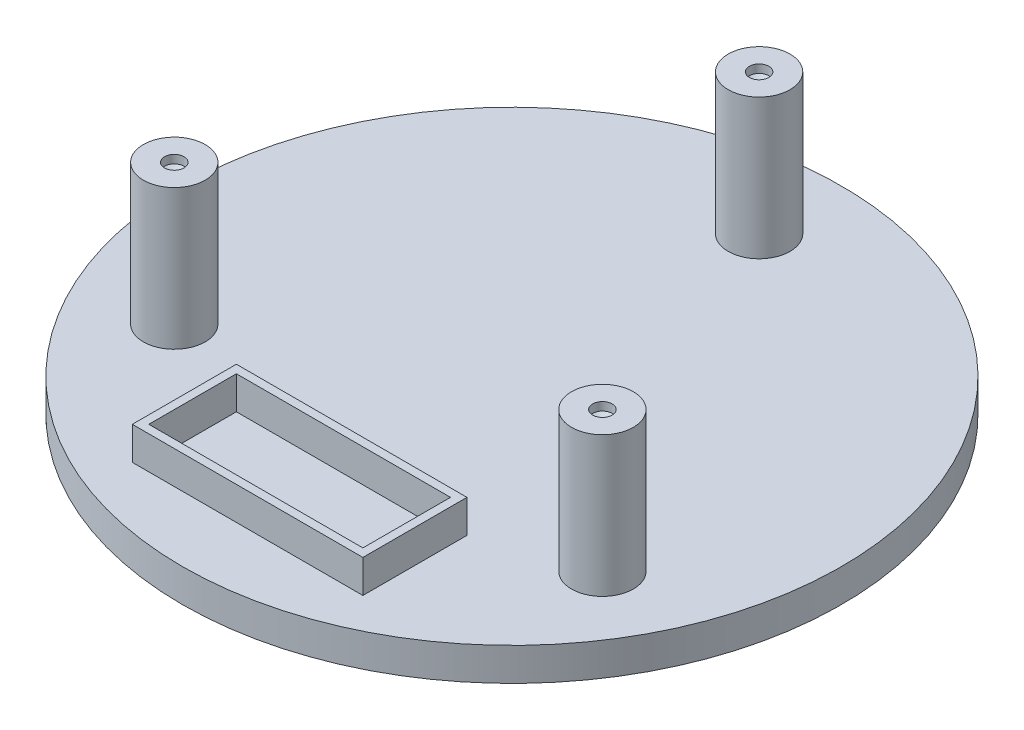
ISO-10303-21;
HEADER;
FILE_DESCRIPTION(('STEP AP214'),'2;1');
FILE_NAME('part.step','',(''),(''),'','','');
FILE_SCHEMA(('AUTOMOTIVE_DESIGN { 1 0 10303 214 1 1 1 1 }'));
ENDSEC;
DATA;
#1=APPLICATION_CONTEXT('core data for automotive mechanical design processes');
#2=APPLICATION_PROTOCOL_DEFINITION('international standard','automotive_design',2000,#1);
#3=PRODUCT_CONTEXT('',#1,'mechanical');
#4=PRODUCT('Part','Part','',(#3));
#5=PRODUCT_RELATED_PRODUCT_CATEGORY('part','',(#4));
#6=PRODUCT_DEFINITION_FORMATION('','',#4);
#7=PRODUCT_DEFINITION_CONTEXT('part definition',#1,'design');
#8=PRODUCT_DEFINITION('design','',#6,#7);
#9=PRODUCT_DEFINITION_SHAPE('','',#8);
#10=(LENGTH_UNIT() NAMED_UNIT(*) SI_UNIT(.MILLI.,.METRE.));
#11=(NAMED_UNIT(*) PLANE_ANGLE_UNIT() SI_UNIT($,.RADIAN.));
#12=(NAMED_UNIT(*) SI_UNIT($,.STERADIAN.) SOLID_ANGLE_UNIT());
#13=UNCERTAINTY_MEASURE_WITH_UNIT(LENGTH_MEASURE(1.E-05),#10,'distance_accuracy_value','');
#14=(GEOMETRIC_REPRESENTATION_CONTEXT(3) GLOBAL_UNCERTAINTY_ASSIGNED_CONTEXT((#13)) GLOBAL_UNIT_ASSIGNED_CONTEXT((#10,
#11,#12)) REPRESENTATION_CONTEXT('',''));
#15=CARTESIAN_POINT('',(0.,0.,0.));
#16=DIRECTION('',(0.,0.,1.));
#17=DIRECTION('',(1.,0.,0.));
#18=AXIS2_PLACEMENT_3D('',#15,#16,#17);
#19=CARTESIAN_POINT('',(0.,0.,0.));
#20=DIRECTION('',(0.,1.,0.));
#21=DIRECTION('',(0.,0.,1.));
#22=AXIS2_PLACEMENT_3D('',#19,#20,#21);
#23=PLANE('',#22);
#24=CARTESIAN_POINT('',(-32.995567884187,0.,19.0500000000002));
#25=DIRECTION('',(0.,1.,0.));
#26=DIRECTION('',(0.,0.,1.));
#27=AXIS2_PLACEMENT_3D('',#24,#25,#26);
#28=CIRCLE('',#27,4.7625);
#29=CARTESIAN_POINT('',(-32.995567884187,0.,23.8125000000002));
#30=VERTEX_POINT('',#29);
#31=EDGE_CURVE('E249',#30,#30,#28,.T.);
#32=ORIENTED_EDGE('',*,*,#31,.F.);
#33=EDGE_LOOP('',(#32));
#34=FACE_BOUND('',#33,.T.);
#35=CARTESIAN_POINT('',(0.,0.,0.));
#36=DIRECTION('',(0.,1.,0.));
#37=DIRECTION('',(0.,0.,1.));
#38=AXIS2_PLACEMENT_3D('',#35,#36,#37);
#39=CIRCLE('',#38,50.8);
#40=CARTESIAN_POINT('',(0.,0.,50.8));
#41=VERTEX_POINT('',#40);
#42=EDGE_CURVE('E11',#41,#41,#39,.T.);
#43=ORIENTED_EDGE('',*,*,#42,.T.);
#44=EDGE_LOOP('',(#43));
#45=FACE_BOUND('',#44,.T.);
#46=CARTESIAN_POINT('',(0.,0.,-38.1));
#47=DIRECTION('',(0.,1.,0.));
#48=DIRECTION('',(0.,0.,1.));
#49=AXIS2_PLACEMENT_3D('',#46,#47,#48);
#50=CIRCLE('',#49,4.7625);
#51=CARTESIAN_POINT('',(0.,0.,-33.3375));
#52=VERTEX_POINT('',#51);
#53=EDGE_CURVE('E257',#52,#52,#50,.T.);
#54=ORIENTED_EDGE('',*,*,#53,.F.);
#55=EDGE_LOOP('',(#54));
#56=FACE_BOUND('',#55,.T.);
#57=CARTESIAN_POINT('',(32.995567884187,0.,19.0500000000002));
#58=DIRECTION('',(0.,1.,0.));
#59=DIRECTION('',(0.,0.,1.));
#60=AXIS2_PLACEMENT_3D('',#57,#58,#59);
#61=CIRCLE('',#60,4.7625);
#62=CARTESIAN_POINT('',(32.995567884187,0.,23.8125000000002));
#63=VERTEX_POINT('',#62);
#64=EDGE_CURVE('E244',#63,#63,#61,.T.);
#65=ORIENTED_EDGE('',*,*,#64,.F.);
#66=EDGE_LOOP('',(#65));
#67=FACE_BOUND('',#66,.T.);
#68=DIRECTION('',(1.,0.,0.));
#69=VECTOR('',#68,1.);
#70=CARTESIAN_POINT('',(-17.77,0.,40.7434608250207));
#71=LINE('',#70,#69);
#72=CARTESIAN_POINT('',(-17.77,0.,40.7434608250207));
#73=VERTEX_POINT('',#72);
#74=CARTESIAN_POINT('',(17.77,0.,40.7434608250207));
#75=VERTEX_POINT('',#74);
#76=EDGE_CURVE('E202',#73,#75,#71,.T.);
#77=ORIENTED_EDGE('',*,*,#76,.F.);
#78=DIRECTION('',(0.,0.,1.));
#79=VECTOR('',#78,1.);
#80=CARTESIAN_POINT('',(-17.77,0.,24.7034608250207));
#81=LINE('',#80,#79);
#82=CARTESIAN_POINT('',(-17.77,0.,24.7034608250207));
#83=VERTEX_POINT('',#82);
#84=EDGE_CURVE('E151',#83,#73,#81,.T.);
#85=ORIENTED_EDGE('',*,*,#84,.F.);
#86=DIRECTION('',(-1.,0.,0.));
#87=VECTOR('',#86,1.);
#88=CARTESIAN_POINT('',(-17.77,0.,24.7034608250207));
#89=LINE('',#88,#87);
#90=CARTESIAN_POINT('',(17.77,0.,24.7034608250207));
#91=VERTEX_POINT('',#90);
#92=EDGE_CURVE('E190',#91,#83,#89,.T.);
#93=ORIENTED_EDGE('',*,*,#92,.F.);
#94=DIRECTION('',(0.,0.,-1.));
#95=VECTOR('',#94,1.);
#96=CARTESIAN_POINT('',(17.77,0.,24.7034608250207));
#97=LINE('',#96,#95);
#98=EDGE_CURVE('E205',#75,#91,#97,.T.);
#99=ORIENTED_EDGE('',*,*,#98,.F.);
#100=EDGE_LOOP('',(#77,#85,#93,#99));
#101=FACE_BOUND('',#100,.T.);
#102=ADVANCED_FACE('F43',(#34,#45,#56,#67,#101),#23,.T.);
#103=CARTESIAN_POINT('',(0.,-2.54000000000001,0.));
#104=DIRECTION('',(0.,-1.,0.));
#105=DIRECTION('',(0.,0.,-1.));
#106=AXIS2_PLACEMENT_3D('',#103,#104,#105);
#107=PLANE('',#106);
#108=CARTESIAN_POINT('',(0.,-2.54000000000001,0.));
#109=DIRECTION('',(0.,1.,0.));
#110=DIRECTION('',(0.,0.,1.));
#111=AXIS2_PLACEMENT_3D('',#108,#109,#110);
#112=CIRCLE('',#111,38.1);
#113=CARTESIAN_POINT('',(0.,-2.54000000000001,38.1));
#114=VERTEX_POINT('',#113);
#115=EDGE_CURVE('E264',#114,#114,#112,.T.);
#116=ORIENTED_EDGE('',*,*,#115,.F.);
#117=EDGE_LOOP('',(#116));
#118=FACE_BOUND('',#117,.T.);
#119=ADVANCED_FACE('F45',(#118),#107,.T.);
#120=CARTESIAN_POINT('',(0.,4.56768535142939,0.));
#121=DIRECTION('',(0.,1.,0.));
#122=DIRECTION('',(0.,0.,1.));
#123=AXIS2_PLACEMENT_3D('',#120,#121,#122);
#124=CYLINDRICAL_SURFACE('',#123,50.8);
#125=CARTESIAN_POINT('',(0.,-5.08000000000001,0.));
#126=DIRECTION('',(0.,1.,0.));
#127=DIRECTION('',(0.,0.,1.));
#128=AXIS2_PLACEMENT_3D('',#125,#126,#127);
#129=CIRCLE('',#128,50.8);
#130=CARTESIAN_POINT('',(0.,-5.08000000000001,50.8));
#131=VERTEX_POINT('',#130);
#132=EDGE_CURVE('E52',#131,#131,#129,.T.);
#133=ORIENTED_EDGE('',*,*,#132,.T.);
#134=EDGE_LOOP('',(#133));
#135=FACE_BOUND('',#134,.T.);
#136=ORIENTED_EDGE('',*,*,#42,.F.);
#137=EDGE_LOOP('',(#136));
#138=FACE_BOUND('',#137,.T.);
#139=ADVANCED_FACE('F278',(#135,#138),#124,.T.);
#140=CARTESIAN_POINT('',(0.,-5.08000000000001,0.));
#141=DIRECTION('',(0.,-1.,0.));
#142=DIRECTION('',(0.,0.,-1.));
#143=AXIS2_PLACEMENT_3D('',#140,#141,#142);
#144=PLANE('',#143);
#145=CARTESIAN_POINT('',(0.,-5.08000000000001,0.));
#146=DIRECTION('',(0.,1.,0.));
#147=DIRECTION('',(0.,0.,1.));
#148=AXIS2_PLACEMENT_3D('',#145,#146,#147);
#149=CIRCLE('',#148,38.1);
#150=CARTESIAN_POINT('',(0.,-5.08000000000001,38.1));
#151=VERTEX_POINT('',#150);
#152=EDGE_CURVE('E271',#151,#151,#149,.T.);
#153=ORIENTED_EDGE('',*,*,#152,.T.);
#154=EDGE_LOOP('',(#153));
#155=FACE_BOUND('',#154,.T.);
#156=ORIENTED_EDGE('',*,*,#132,.F.);
#157=EDGE_LOOP('',(#156));
#158=FACE_BOUND('',#157,.T.);
#159=ADVANCED_FACE('F281',(#155,#158),#144,.T.);
#160=CARTESIAN_POINT('',(0.,4.56768535142939,0.));
#161=DIRECTION('',(0.,1.,0.));
#162=DIRECTION('',(0.,0.,1.));
#163=AXIS2_PLACEMENT_3D('',#160,#161,#162);
#164=CYLINDRICAL_SURFACE('',#163,38.1);
#165=ORIENTED_EDGE('',*,*,#115,.T.);
#166=EDGE_LOOP('',(#165));
#167=FACE_BOUND('',#166,.T.);
#168=ORIENTED_EDGE('',*,*,#152,.F.);
#169=EDGE_LOOP('',(#168));
#170=FACE_BOUND('',#169,.T.);
#171=ADVANCED_FACE('F283',(#167,#170),#164,.F.);
#172=CARTESIAN_POINT('',(0.,21.59,-38.1));
#173=DIRECTION('',(0.,-1.,0.));
#174=DIRECTION('',(0.,0.,-1.));
#175=AXIS2_PLACEMENT_3D('',#172,#173,#174);
#176=CYLINDRICAL_SURFACE('',#175,4.7625);
#177=CARTESIAN_POINT('',(0.,21.59,-38.1));
#178=DIRECTION('',(0.,1.,0.));
#179=DIRECTION('',(0.,0.,1.));
#180=AXIS2_PLACEMENT_3D('',#177,#178,#179);
#181=CIRCLE('',#180,4.7625);
#182=CARTESIAN_POINT('',(0.,21.59,-33.3375));
#183=VERTEX_POINT('',#182);
#184=EDGE_CURVE('E260',#183,#183,#181,.T.);
#185=ORIENTED_EDGE('',*,*,#184,.F.);
#186=EDGE_LOOP('',(#185));
#187=FACE_BOUND('',#186,.T.);
#188=ORIENTED_EDGE('',*,*,#53,.T.);
#189=EDGE_LOOP('',(#188));
#190=FACE_BOUND('',#189,.T.);
#191=ADVANCED_FACE('F290',(#187,#190),#176,.T.);
#192=CARTESIAN_POINT('',(0.,21.59,-38.1));
#193=DIRECTION('',(0.,1.,0.));
#194=DIRECTION('',(0.,0.,1.));
#195=AXIS2_PLACEMENT_3D('',#192,#193,#194);
#196=PLANE('',#195);
#197=CARTESIAN_POINT('',(0.,21.59,-38.1));
#198=DIRECTION('',(0.,1.,0.));
#199=DIRECTION('',(0.,0.,1.));
#200=AXIS2_PLACEMENT_3D('',#197,#198,#199);
#201=CIRCLE('',#200,1.5);
#202=CARTESIAN_POINT('',(0.,21.59,-36.6));
#203=VERTEX_POINT('',#202);
#204=EDGE_CURVE('E228',#203,#203,#201,.T.);
#205=ORIENTED_EDGE('',*,*,#204,.F.);
#206=EDGE_LOOP('',(#205));
#207=FACE_BOUND('',#206,.T.);
#208=ORIENTED_EDGE('',*,*,#184,.T.);
#209=EDGE_LOOP('',(#208));
#210=FACE_BOUND('',#209,.T.);
#211=ADVANCED_FACE('F379',(#207,#210),#196,.T.);
#212=CARTESIAN_POINT('',(-32.995567884187,21.59,19.0500000000002));
#213=DIRECTION('',(0.,-1.,0.));
#214=DIRECTION('',(0.,0.,-1.));
#215=AXIS2_PLACEMENT_3D('',#212,#213,#214);
#216=CYLINDRICAL_SURFACE('',#215,4.7625);
#217=CARTESIAN_POINT('',(-32.995567884187,21.59,19.0500000000002));
#218=DIRECTION('',(0.,1.,0.));
#219=DIRECTION('',(0.,0.,1.));
#220=AXIS2_PLACEMENT_3D('',#217,#218,#219);
#221=CIRCLE('',#220,4.7625);
#222=CARTESIAN_POINT('',(-32.995567884187,21.59,23.8125000000002));
#223=VERTEX_POINT('',#222);
#224=EDGE_CURVE('E253',#223,#223,#221,.T.);
#225=ORIENTED_EDGE('',*,*,#224,.F.);
#226=EDGE_LOOP('',(#225));
#227=FACE_BOUND('',#226,.T.);
#228=ORIENTED_EDGE('',*,*,#31,.T.);
#229=EDGE_LOOP('',(#228));
#230=FACE_BOUND('',#229,.T.);
#231=ADVANCED_FACE('F375',(#227,#230),#216,.T.);
#232=CARTESIAN_POINT('',(-32.995567884187,21.59,19.0500000000002));
#233=DIRECTION('',(0.,1.,0.));
#234=DIRECTION('',(0.,0.,1.));
#235=AXIS2_PLACEMENT_3D('',#232,#233,#234);
#236=PLANE('',#235);
#237=CARTESIAN_POINT('',(-32.995567884187,21.59,19.0500000000002));
#238=DIRECTION('',(0.,1.,0.));
#239=DIRECTION('',(0.,0.,1.));
#240=AXIS2_PLACEMENT_3D('',#237,#238,#239);
#241=CIRCLE('',#240,1.5);
#242=CARTESIAN_POINT('',(-32.995567884187,21.59,20.5500000000002));
#243=VERTEX_POINT('',#242);
#244=EDGE_CURVE('E220',#243,#243,#241,.T.);
#245=ORIENTED_EDGE('',*,*,#244,.F.);
#246=EDGE_LOOP('',(#245));
#247=FACE_BOUND('',#246,.T.);
#248=ORIENTED_EDGE('',*,*,#224,.T.);
#249=EDGE_LOOP('',(#248));
#250=FACE_BOUND('',#249,.T.);
#251=ADVANCED_FACE('F371',(#247,#250),#236,.T.);
#252=CARTESIAN_POINT('',(32.995567884187,21.59,19.0500000000002));
#253=DIRECTION('',(0.,-1.,0.));
#254=DIRECTION('',(0.,0.,-1.));
#255=AXIS2_PLACEMENT_3D('',#252,#253,#254);
#256=CYLINDRICAL_SURFACE('',#255,4.7625);
#257=CARTESIAN_POINT('',(32.995567884187,21.59,19.0500000000002));
#258=DIRECTION('',(0.,1.,0.));
#259=DIRECTION('',(0.,0.,1.));
#260=AXIS2_PLACEMENT_3D('',#257,#258,#259);
#261=CIRCLE('',#260,4.7625);
#262=CARTESIAN_POINT('',(32.995567884187,21.59,23.8125000000002));
#263=VERTEX_POINT('',#262);
#264=EDGE_CURVE('E245',#263,#263,#261,.T.);
#265=ORIENTED_EDGE('',*,*,#264,.F.);
#266=EDGE_LOOP('',(#265));
#267=FACE_BOUND('',#266,.T.);
#268=ORIENTED_EDGE('',*,*,#64,.T.);
#269=EDGE_LOOP('',(#268));
#270=FACE_BOUND('',#269,.T.);
#271=ADVANCED_FACE('F367',(#267,#270),#256,.T.);
#272=CARTESIAN_POINT('',(32.995567884187,21.59,19.0500000000002));
#273=DIRECTION('',(0.,1.,0.));
#274=DIRECTION('',(0.,0.,1.));
#275=AXIS2_PLACEMENT_3D('',#272,#273,#274);
#276=PLANE('',#275);
#277=CARTESIAN_POINT('',(32.995567884187,21.59,19.0500000000002));
#278=DIRECTION('',(0.,1.,0.));
#279=DIRECTION('',(0.,0.,1.));
#280=AXIS2_PLACEMENT_3D('',#277,#278,#279);
#281=CIRCLE('',#280,1.5);
#282=CARTESIAN_POINT('',(32.995567884187,21.59,20.5500000000002));
#283=VERTEX_POINT('',#282);
#284=EDGE_CURVE('E236',#283,#283,#281,.T.);
#285=ORIENTED_EDGE('',*,*,#284,.F.);
#286=EDGE_LOOP('',(#285));
#287=FACE_BOUND('',#286,.T.);
#288=ORIENTED_EDGE('',*,*,#264,.T.);
#289=EDGE_LOOP('',(#288));
#290=FACE_BOUND('',#289,.T.);
#291=ADVANCED_FACE('F363',(#287,#290),#276,.T.);
#292=CARTESIAN_POINT('',(32.995567884187,20.32,19.0500000000002));
#293=DIRECTION('',(0.,1.,0.));
#294=DIRECTION('',(0.,0.,1.));
#295=AXIS2_PLACEMENT_3D('',#292,#293,#294);
#296=CONICAL_SURFACE('',#295,1.5,1.02974425867666);
#297=CARTESIAN_POINT('',(32.995567884187,19.4187090714587,19.0500000000002));
#298=VERTEX_POINT('',#297);
#299=VERTEX_LOOP('',#298);
#300=FACE_BOUND('',#299,.T.);
#301=CARTESIAN_POINT('',(32.995567884187,20.32,19.0500000000002));
#302=DIRECTION('',(0.,1.,0.));
#303=DIRECTION('',(0.,0.,1.));
#304=AXIS2_PLACEMENT_3D('',#301,#302,#303);
#305=CIRCLE('',#304,1.5);
#306=CARTESIAN_POINT('',(32.995567884187,20.32,20.5500000000002));
#307=VERTEX_POINT('',#306);
#308=EDGE_CURVE('E240',#307,#307,#305,.T.);
#309=ORIENTED_EDGE('',*,*,#308,.T.);
#310=EDGE_LOOP('',(#309));
#311=FACE_BOUND('',#310,.T.);
#312=ADVANCED_FACE('F359',(#300,#311),#296,.F.);
#313=CARTESIAN_POINT('',(32.995567884187,21.59,19.0500000000002));
#314=DIRECTION('',(0.,1.,0.));
#315=DIRECTION('',(0.,0.,1.));
#316=AXIS2_PLACEMENT_3D('',#313,#314,#315);
#317=CYLINDRICAL_SURFACE('',#316,1.5);
#318=ORIENTED_EDGE('',*,*,#308,.F.);
#319=EDGE_LOOP('',(#318));
#320=FACE_BOUND('',#319,.T.);
#321=ORIENTED_EDGE('',*,*,#284,.T.);
#322=EDGE_LOOP('',(#321));
#323=FACE_BOUND('',#322,.T.);
#324=ADVANCED_FACE('F355',(#320,#323),#317,.F.);
#325=CARTESIAN_POINT('',(0.,20.32,-38.1));
#326=DIRECTION('',(0.,1.,0.));
#327=DIRECTION('',(0.,0.,1.));
#328=AXIS2_PLACEMENT_3D('',#325,#326,#327);
#329=CONICAL_SURFACE('',#328,1.5,1.02974425867665);
#330=CARTESIAN_POINT('',(0.,19.4187090714587,-38.1));
#331=VERTEX_POINT('',#330);
#332=VERTEX_LOOP('',#331);
#333=FACE_BOUND('',#332,.T.);
#334=CARTESIAN_POINT('',(0.,20.32,-38.1));
#335=DIRECTION('',(0.,1.,0.));
#336=DIRECTION('',(0.,0.,1.));
#337=AXIS2_PLACEMENT_3D('',#334,#335,#336);
#338=CIRCLE('',#337,1.5);
#339=CARTESIAN_POINT('',(0.,20.32,-36.6));
#340=VERTEX_POINT('',#339);
#341=EDGE_CURVE('E232',#340,#340,#338,.T.);
#342=ORIENTED_EDGE('',*,*,#341,.T.);
#343=EDGE_LOOP('',(#342));
#344=FACE_BOUND('',#343,.T.);
#345=ADVANCED_FACE('F351',(#333,#344),#329,.F.);
#346=CARTESIAN_POINT('',(0.,21.59,-38.1));
#347=DIRECTION('',(0.,1.,0.));
#348=DIRECTION('',(0.,0.,1.));
#349=AXIS2_PLACEMENT_3D('',#346,#347,#348);
#350=CYLINDRICAL_SURFACE('',#349,1.5);
#351=ORIENTED_EDGE('',*,*,#341,.F.);
#352=EDGE_LOOP('',(#351));
#353=FACE_BOUND('',#352,.T.);
#354=ORIENTED_EDGE('',*,*,#204,.T.);
#355=EDGE_LOOP('',(#354));
#356=FACE_BOUND('',#355,.T.);
#357=ADVANCED_FACE('F347',(#353,#356),#350,.F.);
#358=CARTESIAN_POINT('',(-32.995567884187,20.32,19.0500000000002));
#359=DIRECTION('',(0.,1.,0.));
#360=DIRECTION('',(0.,0.,1.));
#361=AXIS2_PLACEMENT_3D('',#358,#359,#360);
#362=CONICAL_SURFACE('',#361,1.5,1.02974425867666);
#363=CARTESIAN_POINT('',(-32.995567884187,19.4187090714587,19.0500000000002));
#364=VERTEX_POINT('',#363);
#365=VERTEX_LOOP('',#364);
#366=FACE_BOUND('',#365,.T.);
#367=CARTESIAN_POINT('',(-32.995567884187,20.32,19.0500000000002));
#368=DIRECTION('',(0.,1.,0.));
#369=DIRECTION('',(0.,0.,1.));
#370=AXIS2_PLACEMENT_3D('',#367,#368,#369);
#371=CIRCLE('',#370,1.5);
#372=CARTESIAN_POINT('',(-32.995567884187,20.32,20.5500000000002));
#373=VERTEX_POINT('',#372);
#374=EDGE_CURVE('E224',#373,#373,#371,.T.);
#375=ORIENTED_EDGE('',*,*,#374,.T.);
#376=EDGE_LOOP('',(#375));
#377=FACE_BOUND('',#376,.T.);
#378=ADVANCED_FACE('F343',(#366,#377),#362,.F.);
#379=CARTESIAN_POINT('',(-32.995567884187,21.59,19.0500000000002));
#380=DIRECTION('',(0.,1.,0.));
#381=DIRECTION('',(0.,0.,1.));
#382=AXIS2_PLACEMENT_3D('',#379,#380,#381);
#383=CYLINDRICAL_SURFACE('',#382,1.5);
#384=ORIENTED_EDGE('',*,*,#374,.F.);
#385=EDGE_LOOP('',(#384));
#386=FACE_BOUND('',#385,.T.);
#387=ORIENTED_EDGE('',*,*,#244,.T.);
#388=EDGE_LOOP('',(#387));
#389=FACE_BOUND('',#388,.T.);
#390=ADVANCED_FACE('F326',(#386,#389),#383,.F.);
#391=CARTESIAN_POINT('',(0.,5.08,0.));
#392=DIRECTION('',(0.,1.,0.));
#393=DIRECTION('',(0.,0.,1.));
#394=AXIS2_PLACEMENT_3D('',#391,#392,#393);
#395=PLANE('',#394);
#396=DIRECTION('',(0.,0.,1.));
#397=VECTOR('',#396,1.);
#398=CARTESIAN_POINT('',(-17.77,5.08,24.7034608250207));
#399=LINE('',#398,#397);
#400=CARTESIAN_POINT('',(-17.77,5.08,24.7034608250207));
#401=VERTEX_POINT('',#400);
#402=CARTESIAN_POINT('',(-17.77,5.08,40.7434608250207));
#403=VERTEX_POINT('',#402);
#404=EDGE_CURVE('E185',#401,#403,#399,.T.);
#405=ORIENTED_EDGE('',*,*,#404,.T.);
#406=DIRECTION('',(1.,0.,0.));
#407=VECTOR('',#406,1.);
#408=CARTESIAN_POINT('',(-17.77,5.08,40.7434608250207));
#409=LINE('',#408,#407);
#410=CARTESIAN_POINT('',(17.77,5.08,40.7434608250207));
#411=VERTEX_POINT('',#410);
#412=EDGE_CURVE('E189',#403,#411,#409,.T.);
#413=ORIENTED_EDGE('',*,*,#412,.T.);
#414=DIRECTION('',(0.,0.,-1.));
#415=VECTOR('',#414,1.);
#416=CARTESIAN_POINT('',(17.77,5.08,24.7034608250207));
#417=LINE('',#416,#415);
#418=CARTESIAN_POINT('',(17.77,5.08,24.7034608250207));
#419=VERTEX_POINT('',#418);
#420=EDGE_CURVE('E192',#411,#419,#417,.T.);
#421=ORIENTED_EDGE('',*,*,#420,.T.);
#422=DIRECTION('',(-1.,0.,0.));
#423=VECTOR('',#422,1.);
#424=CARTESIAN_POINT('',(-17.77,5.08,24.7034608250207));
#425=LINE('',#424,#423);
#426=EDGE_CURVE('E195',#419,#401,#425,.T.);
#427=ORIENTED_EDGE('',*,*,#426,.T.);
#428=EDGE_LOOP('',(#405,#413,#421,#427));
#429=FACE_BOUND('',#428,.T.);
#430=DIRECTION('',(1.,0.,0.));
#431=VECTOR('',#430,1.);
#432=CARTESIAN_POINT('',(-16.5,5.08,39.4734608250207));
#433=LINE('',#432,#431);
#434=CARTESIAN_POINT('',(-16.5,5.08,39.4734608250207));
#435=VERTEX_POINT('',#434);
#436=CARTESIAN_POINT('',(16.5,5.08,39.4734608250207));
#437=VERTEX_POINT('',#436);
#438=EDGE_CURVE('E142',#435,#437,#433,.T.);
#439=ORIENTED_EDGE('',*,*,#438,.F.);
#440=DIRECTION('',(0.,0.,1.));
#441=VECTOR('',#440,1.);
#442=CARTESIAN_POINT('',(-16.5,5.08,25.9734608250207));
#443=LINE('',#442,#441);
#444=CARTESIAN_POINT('',(-16.5,5.08,25.9734608250207));
#445=VERTEX_POINT('',#444);
#446=EDGE_CURVE('E132',#445,#435,#443,.T.);
#447=ORIENTED_EDGE('',*,*,#446,.F.);
#448=DIRECTION('',(-1.,0.,0.));
#449=VECTOR('',#448,1.);
#450=CARTESIAN_POINT('',(-16.5,5.08,25.9734608250207));
#451=LINE('',#450,#449);
#452=CARTESIAN_POINT('',(16.5,5.08,25.9734608250207));
#453=VERTEX_POINT('',#452);
#454=EDGE_CURVE('E163',#453,#445,#451,.T.);
#455=ORIENTED_EDGE('',*,*,#454,.F.);
#456=DIRECTION('',(0.,0.,-1.));
#457=VECTOR('',#456,1.);
#458=CARTESIAN_POINT('',(16.5,5.08,25.9734608250207));
#459=LINE('',#458,#457);
#460=EDGE_CURVE('E157',#437,#453,#459,.T.);
#461=ORIENTED_EDGE('',*,*,#460,.F.);
#462=EDGE_LOOP('',(#439,#447,#455,#461));
#463=FACE_BOUND('',#462,.T.);
#464=ADVANCED_FACE('F155',(#429,#463),#395,.T.);
#465=CARTESIAN_POINT('',(-17.77,5.08,24.7034608250207));
#466=DIRECTION('',(1.,0.,0.));
#467=DIRECTION('',(0.,0.,-1.));
#468=AXIS2_PLACEMENT_3D('',#465,#466,#467);
#469=PLANE('',#468);
#470=ORIENTED_EDGE('',*,*,#84,.T.);
#471=DIRECTION('',(0.,-1.,0.));
#472=VECTOR('',#471,1.);
#473=CARTESIAN_POINT('',(-17.77,5.08,40.7434608250207));
#474=LINE('',#473,#472);
#475=EDGE_CURVE('E217',#403,#73,#474,.T.);
#476=ORIENTED_EDGE('',*,*,#475,.F.);
#477=ORIENTED_EDGE('',*,*,#404,.F.);
#478=DIRECTION('',(0.,-1.,0.));
#479=VECTOR('',#478,1.);
#480=CARTESIAN_POINT('',(-17.77,5.08,24.7034608250207));
#481=LINE('',#480,#479);
#482=EDGE_CURVE('E198',#401,#83,#481,.T.);
#483=ORIENTED_EDGE('',*,*,#482,.T.);
#484=EDGE_LOOP('',(#470,#476,#477,#483));
#485=FACE_BOUND('',#484,.T.);
#486=ADVANCED_FACE('F325',(#485),#469,.F.);
#487=CARTESIAN_POINT('',(-17.77,5.08,40.7434608250207));
#488=DIRECTION('',(0.,0.,-1.));
#489=DIRECTION('',(-1.,0.,0.));
#490=AXIS2_PLACEMENT_3D('',#487,#488,#489);
#491=PLANE('',#490);
#492=ORIENTED_EDGE('',*,*,#76,.T.);
#493=DIRECTION('',(0.,-1.,0.));
#494=VECTOR('',#493,1.);
#495=CARTESIAN_POINT('',(17.77,5.08,40.7434608250207));
#496=LINE('',#495,#494);
#497=EDGE_CURVE('E213',#411,#75,#496,.T.);
#498=ORIENTED_EDGE('',*,*,#497,.F.);
#499=ORIENTED_EDGE('',*,*,#412,.F.);
#500=ORIENTED_EDGE('',*,*,#475,.T.);
#501=EDGE_LOOP('',(#492,#498,#499,#500));
#502=FACE_BOUND('',#501,.T.);
#503=ADVANCED_FACE('F333',(#502),#491,.F.);
#504=CARTESIAN_POINT('',(17.77,5.08,24.7034608250207));
#505=DIRECTION('',(-1.,0.,0.));
#506=DIRECTION('',(0.,0.,1.));
#507=AXIS2_PLACEMENT_3D('',#504,#505,#506);
#508=PLANE('',#507);
#509=ORIENTED_EDGE('',*,*,#98,.T.);
#510=DIRECTION('',(0.,-1.,0.));
#511=VECTOR('',#510,1.);
#512=CARTESIAN_POINT('',(17.77,5.08,24.7034608250207));
#513=LINE('',#512,#511);
#514=EDGE_CURVE('E59',#419,#91,#513,.T.);
#515=ORIENTED_EDGE('',*,*,#514,.F.);
#516=ORIENTED_EDGE('',*,*,#420,.F.);
#517=ORIENTED_EDGE('',*,*,#497,.T.);
#518=EDGE_LOOP('',(#509,#515,#516,#517));
#519=FACE_BOUND('',#518,.T.);
#520=ADVANCED_FACE('F330',(#519),#508,.F.);
#521=CARTESIAN_POINT('',(-17.77,5.08,24.7034608250207));
#522=DIRECTION('',(0.,0.,1.));
#523=DIRECTION('',(1.,0.,0.));
#524=AXIS2_PLACEMENT_3D('',#521,#522,#523);
#525=PLANE('',#524);
#526=ORIENTED_EDGE('',*,*,#92,.T.);
#527=ORIENTED_EDGE('',*,*,#482,.F.);
#528=ORIENTED_EDGE('',*,*,#426,.F.);
#529=ORIENTED_EDGE('',*,*,#514,.T.);
#530=EDGE_LOOP('',(#526,#527,#528,#529));
#531=FACE_BOUND('',#530,.T.);
#532=ADVANCED_FACE('F322',(#531),#525,.F.);
#533=CARTESIAN_POINT('',(-16.5,5.08,25.9734608250207));
#534=DIRECTION('',(1.,0.,0.));
#535=DIRECTION('',(0.,0.,-1.));
#536=AXIS2_PLACEMENT_3D('',#533,#534,#535);
#537=PLANE('',#536);
#538=DIRECTION('',(0.,0.,1.));
#539=VECTOR('',#538,1.);
#540=CARTESIAN_POINT('',(-16.5,0.,25.9734608250207));
#541=LINE('',#540,#539);
#542=CARTESIAN_POINT('',(-16.5,0.,25.9734608250207));
#543=VERTEX_POINT('',#542);
#544=CARTESIAN_POINT('',(-16.5,0.,39.4734608250207));
#545=VERTEX_POINT('',#544);
#546=EDGE_CURVE('E70',#543,#545,#541,.T.);
#547=ORIENTED_EDGE('',*,*,#546,.F.);
#548=DIRECTION('',(0.,-1.,0.));
#549=VECTOR('',#548,1.);
#550=CARTESIAN_POINT('',(-16.5,5.08,25.9734608250207));
#551=LINE('',#550,#549);
#552=EDGE_CURVE('E137',#445,#543,#551,.T.);
#553=ORIENTED_EDGE('',*,*,#552,.F.);
#554=ORIENTED_EDGE('',*,*,#446,.T.);
#555=DIRECTION('',(0.,-1.,0.));
#556=VECTOR('',#555,1.);
#557=CARTESIAN_POINT('',(-16.5,5.08,39.4734608250207));
#558=LINE('',#557,#556);
#559=EDGE_CURVE('E135',#435,#545,#558,.T.);
#560=ORIENTED_EDGE('',*,*,#559,.T.);
#561=EDGE_LOOP('',(#547,#553,#554,#560));
#562=FACE_BOUND('',#561,.T.);
#563=ADVANCED_FACE('F134',(#562),#537,.T.);
#564=CARTESIAN_POINT('',(-16.5,5.08,39.4734608250207));
#565=DIRECTION('',(0.,0.,-1.));
#566=DIRECTION('',(-1.,0.,0.));
#567=AXIS2_PLACEMENT_3D('',#564,#565,#566);
#568=PLANE('',#567);
#569=DIRECTION('',(1.,0.,0.));
#570=VECTOR('',#569,1.);
#571=CARTESIAN_POINT('',(-16.5,0.,39.4734608250207));
#572=LINE('',#571,#570);
#573=CARTESIAN_POINT('',(16.5,0.,39.4734608250207));
#574=VERTEX_POINT('',#573);
#575=EDGE_CURVE('E149',#545,#574,#572,.T.);
#576=ORIENTED_EDGE('',*,*,#575,.F.);
#577=ORIENTED_EDGE('',*,*,#559,.F.);
#578=ORIENTED_EDGE('',*,*,#438,.T.);
#579=DIRECTION('',(0.,-1.,0.));
#580=VECTOR('',#579,1.);
#581=CARTESIAN_POINT('',(16.5,5.08,39.4734608250207));
#582=LINE('',#581,#580);
#583=EDGE_CURVE('E152',#437,#574,#582,.T.);
#584=ORIENTED_EDGE('',*,*,#583,.T.);
#585=EDGE_LOOP('',(#576,#577,#578,#584));
#586=FACE_BOUND('',#585,.T.);
#587=ADVANCED_FACE('F146',(#586),#568,.T.);
#588=CARTESIAN_POINT('',(16.5,5.08,25.9734608250207));
#589=DIRECTION('',(-1.,0.,0.));
#590=DIRECTION('',(0.,0.,1.));
#591=AXIS2_PLACEMENT_3D('',#588,#589,#590);
#592=PLANE('',#591);
#593=DIRECTION('',(0.,0.,-1.));
#594=VECTOR('',#593,1.);
#595=CARTESIAN_POINT('',(16.5,0.,25.9734608250207));
#596=LINE('',#595,#594);
#597=CARTESIAN_POINT('',(16.5,0.,25.9734608250207));
#598=VERTEX_POINT('',#597);
#599=EDGE_CURVE('E172',#574,#598,#596,.T.);
#600=ORIENTED_EDGE('',*,*,#599,.F.);
#601=ORIENTED_EDGE('',*,*,#583,.F.);
#602=ORIENTED_EDGE('',*,*,#460,.T.);
#603=DIRECTION('',(0.,-1.,0.));
#604=VECTOR('',#603,1.);
#605=CARTESIAN_POINT('',(16.5,5.08,25.9734608250207));
#606=LINE('',#605,#604);
#607=EDGE_CURVE('E179',#453,#598,#606,.T.);
#608=ORIENTED_EDGE('',*,*,#607,.T.);
#609=EDGE_LOOP('',(#600,#601,#602,#608));
#610=FACE_BOUND('',#609,.T.);
#611=ADVANCED_FACE('F308',(#610),#592,.T.);
#612=CARTESIAN_POINT('',(-16.5,5.08,25.9734608250207));
#613=DIRECTION('',(0.,0.,1.));
#614=DIRECTION('',(1.,0.,0.));
#615=AXIS2_PLACEMENT_3D('',#612,#613,#614);
#616=PLANE('',#615);
#617=DIRECTION('',(-1.,0.,0.));
#618=VECTOR('',#617,1.);
#619=CARTESIAN_POINT('',(-16.5,0.,25.9734608250207));
#620=LINE('',#619,#618);
#621=EDGE_CURVE('E143',#598,#543,#620,.T.);
#622=ORIENTED_EDGE('',*,*,#621,.F.);
#623=ORIENTED_EDGE('',*,*,#607,.F.);
#624=ORIENTED_EDGE('',*,*,#454,.T.);
#625=ORIENTED_EDGE('',*,*,#552,.T.);
#626=EDGE_LOOP('',(#622,#623,#624,#625));
#627=FACE_BOUND('',#626,.T.);
#628=ADVANCED_FACE('F304',(#627),#616,.T.);
#629=ORIENTED_EDGE('',*,*,#546,.T.);
#630=ORIENTED_EDGE('',*,*,#575,.T.);
#631=ORIENTED_EDGE('',*,*,#599,.T.);
#632=ORIENTED_EDGE('',*,*,#621,.T.);
#633=EDGE_LOOP('',(#629,#630,#631,#632));
#634=FACE_BOUND('',#633,.T.);
#635=ADVANCED_FACE('F296',(#634),#23,.T.);
#636=CLOSED_SHELL('',(#102,#119,#139,#159,#171,#191,#211,#231,#251,#271,#291,#312,#324,#345,
#357,#378,#390,#464,#486,#503,#520,#532,#563,#587,#611,#628,#635));
#637=MANIFOLD_SOLID_BREP('B2',#636);
#638=ADVANCED_BREP_SHAPE_REPRESENTATION('',(#18,#637),#14);
#639=SHAPE_DEFINITION_REPRESENTATION(#9,#638);
ENDSEC;
END-ISO-10303-21;
